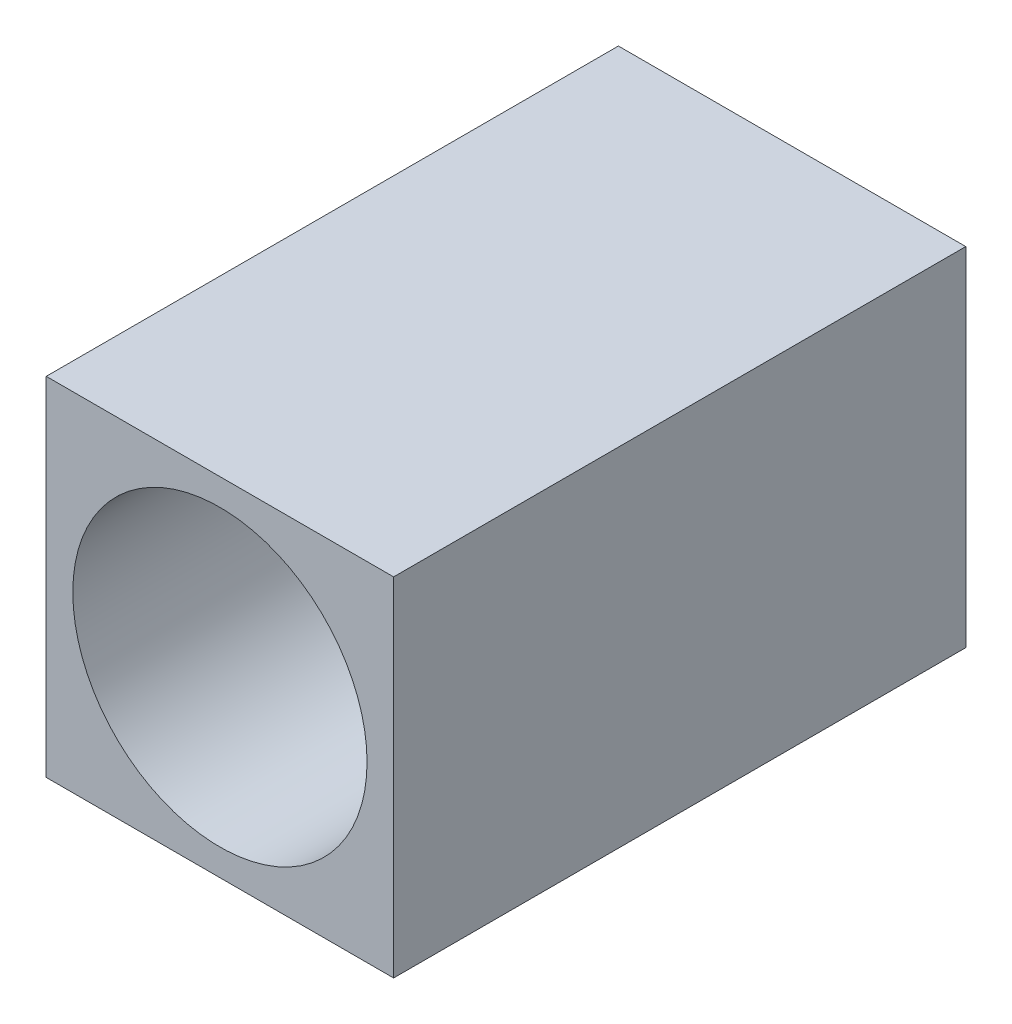
ISO-10303-21;
HEADER;
FILE_DESCRIPTION(('STEP AP214'),'2;1');
FILE_NAME('part.step','',(''),(''),'','','');
FILE_SCHEMA(('AUTOMOTIVE_DESIGN { 1 0 10303 214 1 1 1 1 }'));
ENDSEC;
DATA;
#1=APPLICATION_CONTEXT('core data for automotive mechanical design processes');
#2=APPLICATION_PROTOCOL_DEFINITION('international standard','automotive_design',2000,#1);
#3=PRODUCT_CONTEXT('',#1,'mechanical');
#4=PRODUCT('Part','Part','',(#3));
#5=PRODUCT_RELATED_PRODUCT_CATEGORY('part','',(#4));
#6=PRODUCT_DEFINITION_FORMATION('','',#4);
#7=PRODUCT_DEFINITION_CONTEXT('part definition',#1,'design');
#8=PRODUCT_DEFINITION('design','',#6,#7);
#9=PRODUCT_DEFINITION_SHAPE('','',#8);
#10=(LENGTH_UNIT() NAMED_UNIT(*) SI_UNIT(.MILLI.,.METRE.));
#11=(NAMED_UNIT(*) PLANE_ANGLE_UNIT() SI_UNIT($,.RADIAN.));
#12=(NAMED_UNIT(*) SI_UNIT($,.STERADIAN.) SOLID_ANGLE_UNIT());
#13=UNCERTAINTY_MEASURE_WITH_UNIT(LENGTH_MEASURE(1.E-05),#10,'distance_accuracy_value','');
#14=(GEOMETRIC_REPRESENTATION_CONTEXT(3) GLOBAL_UNCERTAINTY_ASSIGNED_CONTEXT((#13)) GLOBAL_UNIT_ASSIGNED_CONTEXT((#10,
#11,#12)) REPRESENTATION_CONTEXT('',''));
#15=CARTESIAN_POINT('',(0.,0.,0.));
#16=DIRECTION('',(0.,0.,1.));
#17=DIRECTION('',(1.,0.,0.));
#18=AXIS2_PLACEMENT_3D('',#15,#16,#17);
#19=CARTESIAN_POINT('',(0.,0.,140.));
#20=DIRECTION('',(0.,0.,1.));
#21=DIRECTION('',(1.,0.,0.));
#22=AXIS2_PLACEMENT_3D('',#19,#20,#21);
#23=PLANE('',#22);
#24=DIRECTION('',(0.,1.,0.));
#25=VECTOR('',#24,1.);
#26=CARTESIAN_POINT('',(42.5,42.5,140.));
#27=LINE('',#26,#25);
#28=CARTESIAN_POINT('',(42.5,-42.5,140.));
#29=VERTEX_POINT('',#28);
#30=CARTESIAN_POINT('',(42.5,42.5,140.));
#31=VERTEX_POINT('',#30);
#32=EDGE_CURVE('E96',#29,#31,#27,.T.);
#33=ORIENTED_EDGE('',*,*,#32,.T.);
#34=DIRECTION('',(-1.,0.,0.));
#35=VECTOR('',#34,1.);
#36=CARTESIAN_POINT('',(-42.5,42.5,140.));
#37=LINE('',#36,#35);
#38=CARTESIAN_POINT('',(-42.5,42.5,140.));
#39=VERTEX_POINT('',#38);
#40=EDGE_CURVE('E91',#31,#39,#37,.T.);
#41=ORIENTED_EDGE('',*,*,#40,.T.);
#42=DIRECTION('',(0.,-1.,0.));
#43=VECTOR('',#42,1.);
#44=CARTESIAN_POINT('',(-42.5,42.5,140.));
#45=LINE('',#44,#43);
#46=CARTESIAN_POINT('',(-42.5,-42.5,140.));
#47=VERTEX_POINT('',#46);
#48=EDGE_CURVE('E94',#39,#47,#45,.T.);
#49=ORIENTED_EDGE('',*,*,#48,.T.);
#50=DIRECTION('',(1.,0.,0.));
#51=VECTOR('',#50,1.);
#52=CARTESIAN_POINT('',(-42.5,-42.5,140.));
#53=LINE('',#52,#51);
#54=EDGE_CURVE('E61',#47,#29,#53,.T.);
#55=ORIENTED_EDGE('',*,*,#54,.T.);
#56=EDGE_LOOP('',(#33,#41,#49,#55));
#57=FACE_BOUND('',#56,.T.);
#58=CARTESIAN_POINT('',(0.,0.,140.));
#59=DIRECTION('',(0.,0.,1.));
#60=DIRECTION('',(1.,0.,0.));
#61=AXIS2_PLACEMENT_3D('',#58,#59,#60);
#62=CIRCLE('',#61,36.);
#63=CARTESIAN_POINT('',(36.,0.,140.));
#64=VERTEX_POINT('',#63);
#65=EDGE_CURVE('E116',#64,#64,#62,.T.);
#66=ORIENTED_EDGE('',*,*,#65,.F.);
#67=EDGE_LOOP('',(#66));
#68=FACE_BOUND('',#67,.T.);
#69=ADVANCED_FACE('F43',(#57,#68),#23,.T.);
#70=CARTESIAN_POINT('',(0.,0.,0.));
#71=DIRECTION('',(0.,0.,1.));
#72=DIRECTION('',(1.,0.,0.));
#73=AXIS2_PLACEMENT_3D('',#70,#71,#72);
#74=PLANE('',#73);
#75=DIRECTION('',(0.,1.,0.));
#76=VECTOR('',#75,1.);
#77=CARTESIAN_POINT('',(42.5,42.5,0.));
#78=LINE('',#77,#76);
#79=CARTESIAN_POINT('',(42.5,-42.5,0.));
#80=VERTEX_POINT('',#79);
#81=CARTESIAN_POINT('',(42.5,42.5,0.));
#82=VERTEX_POINT('',#81);
#83=EDGE_CURVE('E112',#80,#82,#78,.T.);
#84=ORIENTED_EDGE('',*,*,#83,.F.);
#85=DIRECTION('',(1.,0.,0.));
#86=VECTOR('',#85,1.);
#87=CARTESIAN_POINT('',(-42.5,-42.5,0.));
#88=LINE('',#87,#86);
#89=CARTESIAN_POINT('',(-42.5,-42.5,0.));
#90=VERTEX_POINT('',#89);
#91=EDGE_CURVE('E84',#90,#80,#88,.T.);
#92=ORIENTED_EDGE('',*,*,#91,.F.);
#93=DIRECTION('',(0.,-1.,0.));
#94=VECTOR('',#93,1.);
#95=CARTESIAN_POINT('',(-42.5,42.5,0.));
#96=LINE('',#95,#94);
#97=CARTESIAN_POINT('',(-42.5,42.5,0.));
#98=VERTEX_POINT('',#97);
#99=EDGE_CURVE('E78',#98,#90,#96,.T.);
#100=ORIENTED_EDGE('',*,*,#99,.F.);
#101=DIRECTION('',(-1.,0.,0.));
#102=VECTOR('',#101,1.);
#103=CARTESIAN_POINT('',(-42.5,42.5,0.));
#104=LINE('',#103,#102);
#105=EDGE_CURVE('E101',#82,#98,#104,.T.);
#106=ORIENTED_EDGE('',*,*,#105,.F.);
#107=EDGE_LOOP('',(#84,#92,#100,#106));
#108=FACE_BOUND('',#107,.T.);
#109=CARTESIAN_POINT('',(0.,0.,0.));
#110=DIRECTION('',(0.,0.,1.));
#111=DIRECTION('',(1.,0.,0.));
#112=AXIS2_PLACEMENT_3D('',#109,#110,#111);
#113=CIRCLE('',#112,36.);
#114=CARTESIAN_POINT('',(36.,0.,0.));
#115=VERTEX_POINT('',#114);
#116=EDGE_CURVE('E134',#115,#115,#113,.T.);
#117=ORIENTED_EDGE('',*,*,#116,.T.);
#118=EDGE_LOOP('',(#117));
#119=FACE_BOUND('',#118,.T.);
#120=ADVANCED_FACE('F129',(#108,#119),#74,.F.);
#121=CARTESIAN_POINT('',(42.5,42.5,140.));
#122=DIRECTION('',(-1.,0.,0.));
#123=DIRECTION('',(0.,-1.,0.));
#124=AXIS2_PLACEMENT_3D('',#121,#122,#123);
#125=PLANE('',#124);
#126=ORIENTED_EDGE('',*,*,#83,.T.);
#127=DIRECTION('',(0.,0.,-1.));
#128=VECTOR('',#127,1.);
#129=CARTESIAN_POINT('',(42.5,42.5,140.));
#130=LINE('',#129,#128);
#131=EDGE_CURVE('E11',#31,#82,#130,.T.);
#132=ORIENTED_EDGE('',*,*,#131,.F.);
#133=ORIENTED_EDGE('',*,*,#32,.F.);
#134=DIRECTION('',(0.,0.,-1.));
#135=VECTOR('',#134,1.);
#136=CARTESIAN_POINT('',(42.5,-42.5,140.));
#137=LINE('',#136,#135);
#138=EDGE_CURVE('E108',#29,#80,#137,.T.);
#139=ORIENTED_EDGE('',*,*,#138,.T.);
#140=EDGE_LOOP('',(#126,#132,#133,#139));
#141=FACE_BOUND('',#140,.T.);
#142=ADVANCED_FACE('F45',(#141),#125,.F.);
#143=CARTESIAN_POINT('',(-42.5,42.5,140.));
#144=DIRECTION('',(0.,-1.,0.));
#145=DIRECTION('',(0.,0.,-1.));
#146=AXIS2_PLACEMENT_3D('',#143,#144,#145);
#147=PLANE('',#146);
#148=ORIENTED_EDGE('',*,*,#105,.T.);
#149=DIRECTION('',(0.,0.,-1.));
#150=VECTOR('',#149,1.);
#151=CARTESIAN_POINT('',(-42.5,42.5,140.));
#152=LINE('',#151,#150);
#153=EDGE_CURVE('E53',#39,#98,#152,.T.);
#154=ORIENTED_EDGE('',*,*,#153,.F.);
#155=ORIENTED_EDGE('',*,*,#40,.F.);
#156=ORIENTED_EDGE('',*,*,#131,.T.);
#157=EDGE_LOOP('',(#148,#154,#155,#156));
#158=FACE_BOUND('',#157,.T.);
#159=ADVANCED_FACE('F100',(#158),#147,.F.);
#160=CARTESIAN_POINT('',(-42.5,42.5,140.));
#161=DIRECTION('',(1.,0.,0.));
#162=DIRECTION('',(0.,1.,0.));
#163=AXIS2_PLACEMENT_3D('',#160,#161,#162);
#164=PLANE('',#163);
#165=ORIENTED_EDGE('',*,*,#99,.T.);
#166=DIRECTION('',(0.,0.,-1.));
#167=VECTOR('',#166,1.);
#168=CARTESIAN_POINT('',(-42.5,-42.5,140.));
#169=LINE('',#168,#167);
#170=EDGE_CURVE('E103',#47,#90,#169,.T.);
#171=ORIENTED_EDGE('',*,*,#170,.F.);
#172=ORIENTED_EDGE('',*,*,#48,.F.);
#173=ORIENTED_EDGE('',*,*,#153,.T.);
#174=EDGE_LOOP('',(#165,#171,#172,#173));
#175=FACE_BOUND('',#174,.T.);
#176=ADVANCED_FACE('F104',(#175),#164,.F.);
#177=CARTESIAN_POINT('',(-42.5,-42.5,140.));
#178=DIRECTION('',(0.,1.,0.));
#179=DIRECTION('',(0.,0.,1.));
#180=AXIS2_PLACEMENT_3D('',#177,#178,#179);
#181=PLANE('',#180);
#182=ORIENTED_EDGE('',*,*,#91,.T.);
#183=ORIENTED_EDGE('',*,*,#138,.F.);
#184=ORIENTED_EDGE('',*,*,#54,.F.);
#185=ORIENTED_EDGE('',*,*,#170,.T.);
#186=EDGE_LOOP('',(#182,#183,#184,#185));
#187=FACE_BOUND('',#186,.T.);
#188=ADVANCED_FACE('F126',(#187),#181,.F.);
#189=CARTESIAN_POINT('',(0.,0.,140.));
#190=DIRECTION('',(0.,0.,-1.));
#191=DIRECTION('',(-1.,0.,0.));
#192=AXIS2_PLACEMENT_3D('',#189,#190,#191);
#193=CYLINDRICAL_SURFACE('',#192,36.);
#194=ORIENTED_EDGE('',*,*,#65,.T.);
#195=EDGE_LOOP('',(#194));
#196=FACE_BOUND('',#195,.T.);
#197=ORIENTED_EDGE('',*,*,#116,.F.);
#198=EDGE_LOOP('',(#197));
#199=FACE_BOUND('',#198,.T.);
#200=ADVANCED_FACE('F142',(#196,#199),#193,.F.);
#201=CLOSED_SHELL('',(#69,#120,#142,#159,#176,#188,#200));
#202=MANIFOLD_SOLID_BREP('B2',#201);
#203=ADVANCED_BREP_SHAPE_REPRESENTATION('',(#18,#202),#14);
#204=SHAPE_DEFINITION_REPRESENTATION(#9,#203);
ENDSEC;
END-ISO-10303-21;
